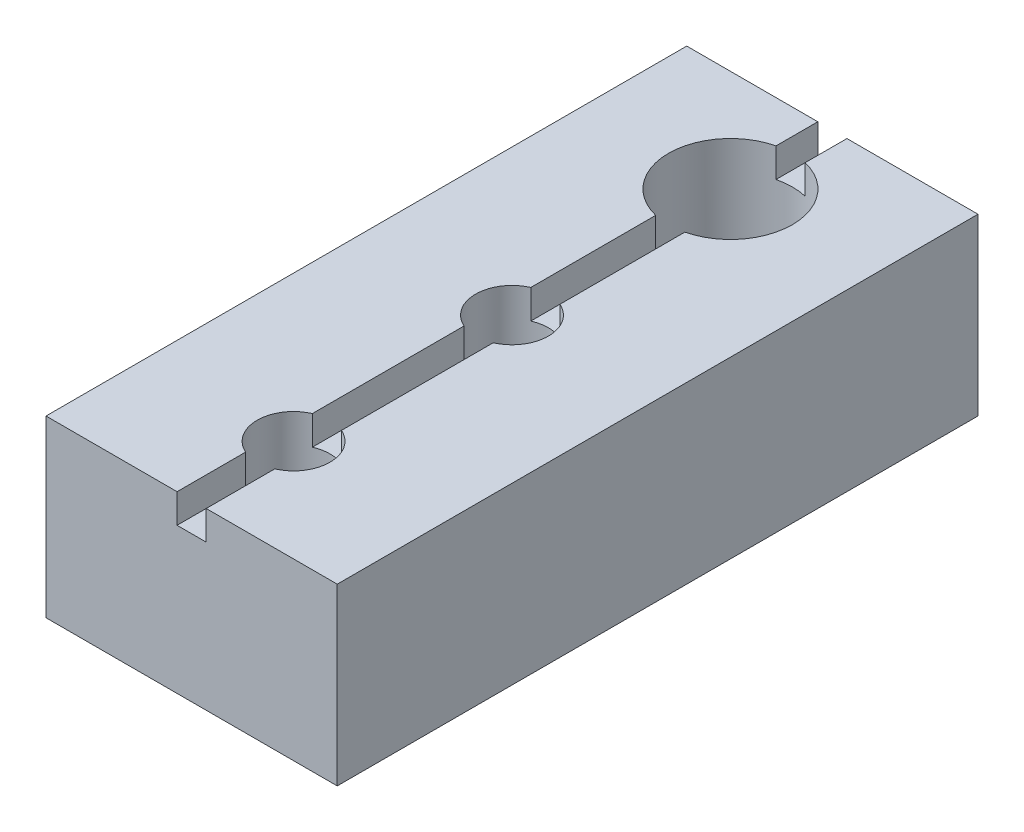
ISO-10303-21;
HEADER;
FILE_DESCRIPTION(('STEP AP214'),'2;1');
FILE_NAME('part.step','',(''),(''),'','','');
FILE_SCHEMA(('AUTOMOTIVE_DESIGN { 1 0 10303 214 1 1 1 1 }'));
ENDSEC;
DATA;
#1=APPLICATION_CONTEXT('core data for automotive mechanical design processes');
#2=APPLICATION_PROTOCOL_DEFINITION('international standard','automotive_design',2000,#1);
#3=PRODUCT_CONTEXT('',#1,'mechanical');
#4=PRODUCT('Part','Part','',(#3));
#5=PRODUCT_RELATED_PRODUCT_CATEGORY('part','',(#4));
#6=PRODUCT_DEFINITION_FORMATION('','',#4);
#7=PRODUCT_DEFINITION_CONTEXT('part definition',#1,'design');
#8=PRODUCT_DEFINITION('design','',#6,#7);
#9=PRODUCT_DEFINITION_SHAPE('','',#8);
#10=(LENGTH_UNIT() NAMED_UNIT(*) SI_UNIT(.MILLI.,.METRE.));
#11=(NAMED_UNIT(*) PLANE_ANGLE_UNIT() SI_UNIT($,.RADIAN.));
#12=(NAMED_UNIT(*) SI_UNIT($,.STERADIAN.) SOLID_ANGLE_UNIT());
#13=UNCERTAINTY_MEASURE_WITH_UNIT(LENGTH_MEASURE(1.E-05),#10,'distance_accuracy_value','');
#14=(GEOMETRIC_REPRESENTATION_CONTEXT(3) GLOBAL_UNCERTAINTY_ASSIGNED_CONTEXT((#13)) GLOBAL_UNIT_ASSIGNED_CONTEXT((#10,
#11,#12)) REPRESENTATION_CONTEXT('',''));
#15=CARTESIAN_POINT('',(0.,0.,0.));
#16=DIRECTION('',(0.,0.,1.));
#17=DIRECTION('',(1.,0.,0.));
#18=AXIS2_PLACEMENT_3D('',#15,#16,#17);
#19=CARTESIAN_POINT('',(10.,6.,22.));
#20=DIRECTION('',(0.,-1.,0.));
#21=DIRECTION('',(0.,0.,-1.));
#22=AXIS2_PLACEMENT_3D('',#19,#20,#21);
#23=PLANE('',#22);
#24=CARTESIAN_POINT('',(0.,6.,-15.));
#25=DIRECTION('',(0.,1.,0.));
#26=DIRECTION('',(0.,0.,1.));
#27=AXIS2_PLACEMENT_3D('',#24,#25,#26);
#28=CIRCLE('',#27,4.24999999999999);
#29=CARTESIAN_POINT('',(0.999999999999999,6.,-10.8693220895354));
#30=VERTEX_POINT('',#29);
#31=CARTESIAN_POINT('',(0.999999999999999,6.,-19.1306779104646));
#32=VERTEX_POINT('',#31);
#33=EDGE_CURVE('E175',#30,#32,#28,.T.);
#34=ORIENTED_EDGE('',*,*,#33,.F.);
#35=DIRECTION('',(0.,0.,-1.));
#36=VECTOR('',#35,1.);
#37=CARTESIAN_POINT('',(0.999999999999999,6.,22.));
#38=LINE('',#37,#36);
#39=CARTESIAN_POINT('',(0.999999999999999,6.,-2.29128784747791));
#40=VERTEX_POINT('',#39);
#41=EDGE_CURVE('E185',#40,#30,#38,.T.);
#42=ORIENTED_EDGE('',*,*,#41,.F.);
#43=CARTESIAN_POINT('',(0.,6.,0.));
#44=DIRECTION('',(0.,1.,0.));
#45=DIRECTION('',(0.,0.,1.));
#46=AXIS2_PLACEMENT_3D('',#43,#44,#45);
#47=CIRCLE('',#46,2.49999999999999);
#48=CARTESIAN_POINT('',(0.999999999999999,6.,2.29128784747791));
#49=VERTEX_POINT('',#48);
#50=EDGE_CURVE('E229',#49,#40,#47,.T.);
#51=ORIENTED_EDGE('',*,*,#50,.F.);
#52=CARTESIAN_POINT('',(0.999999999999999,6.,12.7087121525221));
#53=VERTEX_POINT('',#52);
#54=EDGE_CURVE('E193',#53,#49,#38,.T.);
#55=ORIENTED_EDGE('',*,*,#54,.F.);
#56=CARTESIAN_POINT('',(0.,6.,15.));
#57=DIRECTION('',(0.,1.,0.));
#58=DIRECTION('',(0.,0.,1.));
#59=AXIS2_PLACEMENT_3D('',#56,#57,#58);
#60=CIRCLE('',#59,2.49999999999999);
#61=CARTESIAN_POINT('',(0.999999999999997,6.,17.2912878474779));
#62=VERTEX_POINT('',#61);
#63=EDGE_CURVE('E222',#62,#53,#60,.T.);
#64=ORIENTED_EDGE('',*,*,#63,.F.);
#65=CARTESIAN_POINT('',(0.999999999999999,6.,22.));
#66=VERTEX_POINT('',#65);
#67=EDGE_CURVE('E195',#66,#62,#38,.T.);
#68=ORIENTED_EDGE('',*,*,#67,.F.);
#69=DIRECTION('',(-1.,0.,0.));
#70=VECTOR('',#69,1.);
#71=CARTESIAN_POINT('',(10.,6.,22.));
#72=LINE('',#71,#70);
#73=CARTESIAN_POINT('',(10.,6.,22.));
#74=VERTEX_POINT('',#73);
#75=EDGE_CURVE('E244',#74,#66,#72,.T.);
#76=ORIENTED_EDGE('',*,*,#75,.F.);
#77=DIRECTION('',(0.,0.,-1.));
#78=VECTOR('',#77,1.);
#79=CARTESIAN_POINT('',(10.,6.,22.));
#80=LINE('',#79,#78);
#81=CARTESIAN_POINT('',(10.,6.,-22.));
#82=VERTEX_POINT('',#81);
#83=EDGE_CURVE('E258',#74,#82,#80,.T.);
#84=ORIENTED_EDGE('',*,*,#83,.T.);
#85=DIRECTION('',(-1.,0.,0.));
#86=VECTOR('',#85,1.);
#87=CARTESIAN_POINT('',(10.,6.,-22.));
#88=LINE('',#87,#86);
#89=CARTESIAN_POINT('',(0.999999999999999,6.,-22.));
#90=VERTEX_POINT('',#89);
#91=EDGE_CURVE('E239',#82,#90,#88,.T.);
#92=ORIENTED_EDGE('',*,*,#91,.T.);
#93=EDGE_CURVE('E188',#32,#90,#38,.T.);
#94=ORIENTED_EDGE('',*,*,#93,.F.);
#95=EDGE_LOOP('',(#34,#42,#51,#55,#64,#68,#76,#84,#92,#94));
#96=FACE_BOUND('',#95,.T.);
#97=ADVANCED_FACE('F37',(#96),#23,.F.);
#98=CARTESIAN_POINT('',(-1.,6.,-19.1306779104646));
#99=VERTEX_POINT('',#98);
#100=CARTESIAN_POINT('',(-1.,6.,-10.8693220895354));
#101=VERTEX_POINT('',#100);
#102=EDGE_CURVE('E45',#99,#101,#28,.T.);
#103=ORIENTED_EDGE('',*,*,#102,.F.);
#104=DIRECTION('',(0.,0.,-1.));
#105=VECTOR('',#104,1.);
#106=CARTESIAN_POINT('',(-1.,6.,22.));
#107=LINE('',#106,#105);
#108=CARTESIAN_POINT('',(-1.,6.,-22.));
#109=VERTEX_POINT('',#108);
#110=EDGE_CURVE('E205',#99,#109,#107,.T.);
#111=ORIENTED_EDGE('',*,*,#110,.T.);
#112=CARTESIAN_POINT('',(-10.,6.,-22.));
#113=VERTEX_POINT('',#112);
#114=EDGE_CURVE('E254',#109,#113,#88,.T.);
#115=ORIENTED_EDGE('',*,*,#114,.T.);
#116=DIRECTION('',(0.,0.,-1.));
#117=VECTOR('',#116,1.);
#118=CARTESIAN_POINT('',(-10.,6.,22.));
#119=LINE('',#118,#117);
#120=CARTESIAN_POINT('',(-10.,6.,22.));
#121=VERTEX_POINT('',#120);
#122=EDGE_CURVE('E247',#121,#113,#119,.T.);
#123=ORIENTED_EDGE('',*,*,#122,.F.);
#124=CARTESIAN_POINT('',(-1.,6.,22.));
#125=VERTEX_POINT('',#124);
#126=EDGE_CURVE('E243',#125,#121,#72,.T.);
#127=ORIENTED_EDGE('',*,*,#126,.F.);
#128=CARTESIAN_POINT('',(-1.,6.,17.2912878474779));
#129=VERTEX_POINT('',#128);
#130=EDGE_CURVE('E196',#125,#129,#107,.T.);
#131=ORIENTED_EDGE('',*,*,#130,.T.);
#132=CARTESIAN_POINT('',(-1.,6.,12.7087121525221));
#133=VERTEX_POINT('',#132);
#134=EDGE_CURVE('E221',#133,#129,#60,.T.);
#135=ORIENTED_EDGE('',*,*,#134,.F.);
#136=CARTESIAN_POINT('',(-1.,6.,2.29128784747791));
#137=VERTEX_POINT('',#136);
#138=EDGE_CURVE('E204',#133,#137,#107,.T.);
#139=ORIENTED_EDGE('',*,*,#138,.T.);
#140=CARTESIAN_POINT('',(-1.,6.,-2.29128784747791));
#141=VERTEX_POINT('',#140);
#142=EDGE_CURVE('E228',#141,#137,#47,.T.);
#143=ORIENTED_EDGE('',*,*,#142,.F.);
#144=EDGE_CURVE('E384',#141,#101,#107,.T.);
#145=ORIENTED_EDGE('',*,*,#144,.T.);
#146=EDGE_LOOP('',(#103,#111,#115,#123,#127,#131,#135,#139,#143,#145));
#147=FACE_BOUND('',#146,.T.);
#148=ADVANCED_FACE('F345',(#147),#23,.F.);
#149=CARTESIAN_POINT('',(-10.,6.,22.));
#150=DIRECTION('',(1.,0.,0.));
#151=DIRECTION('',(0.,0.,-1.));
#152=AXIS2_PLACEMENT_3D('',#149,#150,#151);
#153=PLANE('',#152);
#154=DIRECTION('',(0.,-1.,0.));
#155=VECTOR('',#154,1.);
#156=CARTESIAN_POINT('',(-10.,6.,-22.));
#157=LINE('',#156,#155);
#158=CARTESIAN_POINT('',(-10.,-6.,-22.));
#159=VERTEX_POINT('',#158);
#160=EDGE_CURVE('E234',#113,#159,#157,.T.);
#161=ORIENTED_EDGE('',*,*,#160,.T.);
#162=DIRECTION('',(0.,0.,-1.));
#163=VECTOR('',#162,1.);
#164=CARTESIAN_POINT('',(-10.,-6.,22.));
#165=LINE('',#164,#163);
#166=CARTESIAN_POINT('',(-10.,-6.,22.));
#167=VERTEX_POINT('',#166);
#168=EDGE_CURVE('E264',#167,#159,#165,.T.);
#169=ORIENTED_EDGE('',*,*,#168,.F.);
#170=DIRECTION('',(0.,-1.,0.));
#171=VECTOR('',#170,1.);
#172=CARTESIAN_POINT('',(-10.,6.,22.));
#173=LINE('',#172,#171);
#174=EDGE_CURVE('E235',#121,#167,#173,.T.);
#175=ORIENTED_EDGE('',*,*,#174,.F.);
#176=ORIENTED_EDGE('',*,*,#122,.T.);
#177=EDGE_LOOP('',(#161,#169,#175,#176));
#178=FACE_BOUND('',#177,.T.);
#179=ADVANCED_FACE('F39',(#178),#153,.F.);
#180=CARTESIAN_POINT('',(10.,-6.,22.));
#181=DIRECTION('',(0.,1.,0.));
#182=DIRECTION('',(0.,0.,1.));
#183=AXIS2_PLACEMENT_3D('',#180,#181,#182);
#184=PLANE('',#183);
#185=CARTESIAN_POINT('',(0.,-6.,-15.));
#186=DIRECTION('',(0.,1.,0.));
#187=DIRECTION('',(0.,0.,1.));
#188=AXIS2_PLACEMENT_3D('',#185,#186,#187);
#189=CIRCLE('',#188,4.25);
#190=CARTESIAN_POINT('',(0.,-6.,-10.75));
#191=VERTEX_POINT('',#190);
#192=EDGE_CURVE('E179',#191,#191,#189,.T.);
#193=ORIENTED_EDGE('',*,*,#192,.T.);
#194=EDGE_LOOP('',(#193));
#195=FACE_BOUND('',#194,.T.);
#196=CARTESIAN_POINT('',(0.,-6.,15.));
#197=DIRECTION('',(0.,1.,0.));
#198=DIRECTION('',(0.,0.,1.));
#199=AXIS2_PLACEMENT_3D('',#196,#197,#198);
#200=CIRCLE('',#199,2.5);
#201=CARTESIAN_POINT('',(0.,-6.,17.5));
#202=VERTEX_POINT('',#201);
#203=EDGE_CURVE('E225',#202,#202,#200,.T.);
#204=ORIENTED_EDGE('',*,*,#203,.T.);
#205=EDGE_LOOP('',(#204));
#206=FACE_BOUND('',#205,.T.);
#207=CARTESIAN_POINT('',(0.,-6.,0.));
#208=DIRECTION('',(0.,1.,0.));
#209=DIRECTION('',(0.,0.,1.));
#210=AXIS2_PLACEMENT_3D('',#207,#208,#209);
#211=CIRCLE('',#210,2.5);
#212=CARTESIAN_POINT('',(0.,-6.,2.5));
#213=VERTEX_POINT('',#212);
#214=EDGE_CURVE('E231',#213,#213,#211,.T.);
#215=ORIENTED_EDGE('',*,*,#214,.T.);
#216=EDGE_LOOP('',(#215));
#217=FACE_BOUND('',#216,.T.);
#218=DIRECTION('',(1.,0.,0.));
#219=VECTOR('',#218,1.);
#220=CARTESIAN_POINT('',(10.,-6.,-22.));
#221=LINE('',#220,#219);
#222=CARTESIAN_POINT('',(10.,-6.,-22.));
#223=VERTEX_POINT('',#222);
#224=EDGE_CURVE('E250',#159,#223,#221,.T.);
#225=ORIENTED_EDGE('',*,*,#224,.T.);
#226=DIRECTION('',(0.,0.,-1.));
#227=VECTOR('',#226,1.);
#228=CARTESIAN_POINT('',(10.,-6.,22.));
#229=LINE('',#228,#227);
#230=CARTESIAN_POINT('',(10.,-6.,22.));
#231=VERTEX_POINT('',#230);
#232=EDGE_CURVE('E261',#231,#223,#229,.T.);
#233=ORIENTED_EDGE('',*,*,#232,.F.);
#234=DIRECTION('',(1.,0.,0.));
#235=VECTOR('',#234,1.);
#236=CARTESIAN_POINT('',(10.,-6.,22.));
#237=LINE('',#236,#235);
#238=EDGE_CURVE('E238',#167,#231,#237,.T.);
#239=ORIENTED_EDGE('',*,*,#238,.F.);
#240=ORIENTED_EDGE('',*,*,#168,.T.);
#241=EDGE_LOOP('',(#225,#233,#239,#240));
#242=FACE_BOUND('',#241,.T.);
#243=ADVANCED_FACE('F330',(#195,#206,#217,#242),#184,.F.);
#244=CARTESIAN_POINT('',(10.,6.,22.));
#245=DIRECTION('',(-1.,0.,0.));
#246=DIRECTION('',(0.,0.,1.));
#247=AXIS2_PLACEMENT_3D('',#244,#245,#246);
#248=PLANE('',#247);
#249=DIRECTION('',(0.,1.,0.));
#250=VECTOR('',#249,1.);
#251=CARTESIAN_POINT('',(10.,6.,-22.));
#252=LINE('',#251,#250);
#253=EDGE_CURVE('E252',#223,#82,#252,.T.);
#254=ORIENTED_EDGE('',*,*,#253,.T.);
#255=ORIENTED_EDGE('',*,*,#83,.F.);
#256=DIRECTION('',(0.,1.,0.));
#257=VECTOR('',#256,1.);
#258=CARTESIAN_POINT('',(10.,6.,22.));
#259=LINE('',#258,#257);
#260=EDGE_CURVE('E241',#231,#74,#259,.T.);
#261=ORIENTED_EDGE('',*,*,#260,.F.);
#262=ORIENTED_EDGE('',*,*,#232,.T.);
#263=EDGE_LOOP('',(#254,#255,#261,#262));
#264=FACE_BOUND('',#263,.T.);
#265=ADVANCED_FACE('F355',(#264),#248,.F.);
#266=CARTESIAN_POINT('',(0.,0.,22.));
#267=DIRECTION('',(0.,0.,-1.));
#268=DIRECTION('',(-1.,0.,0.));
#269=AXIS2_PLACEMENT_3D('',#266,#267,#268);
#270=PLANE('',#269);
#271=DIRECTION('',(-1.,0.,0.));
#272=VECTOR('',#271,1.);
#273=CARTESIAN_POINT('',(1.,4.,22.));
#274=LINE('',#273,#272);
#275=CARTESIAN_POINT('',(1.,4.,22.));
#276=VERTEX_POINT('',#275);
#277=CARTESIAN_POINT('',(-1.,4.,22.));
#278=VERTEX_POINT('',#277);
#279=EDGE_CURVE('E311',#276,#278,#274,.T.);
#280=ORIENTED_EDGE('',*,*,#279,.T.);
#281=DIRECTION('',(0.,1.,0.));
#282=VECTOR('',#281,1.);
#283=CARTESIAN_POINT('',(-1.,4.,22.));
#284=LINE('',#283,#282);
#285=EDGE_CURVE('E304',#278,#125,#284,.T.);
#286=ORIENTED_EDGE('',*,*,#285,.T.);
#287=ORIENTED_EDGE('',*,*,#126,.T.);
#288=ORIENTED_EDGE('',*,*,#174,.T.);
#289=ORIENTED_EDGE('',*,*,#238,.T.);
#290=ORIENTED_EDGE('',*,*,#260,.T.);
#291=ORIENTED_EDGE('',*,*,#75,.T.);
#292=DIRECTION('',(0.,-1.,0.));
#293=VECTOR('',#292,1.);
#294=CARTESIAN_POINT('',(1.,4.,22.));
#295=LINE('',#294,#293);
#296=EDGE_CURVE('E314',#66,#276,#295,.T.);
#297=ORIENTED_EDGE('',*,*,#296,.T.);
#298=EDGE_LOOP('',(#280,#286,#287,#288,#289,#290,#291,#297));
#299=FACE_BOUND('',#298,.T.);
#300=ADVANCED_FACE('F357',(#299),#270,.F.);
#301=CARTESIAN_POINT('',(0.,0.,-22.));
#302=DIRECTION('',(0.,0.,-1.));
#303=DIRECTION('',(-1.,0.,0.));
#304=AXIS2_PLACEMENT_3D('',#301,#302,#303);
#305=PLANE('',#304);
#306=DIRECTION('',(0.,1.,0.));
#307=VECTOR('',#306,1.);
#308=CARTESIAN_POINT('',(-1.,4.,-22.));
#309=LINE('',#308,#307);
#310=CARTESIAN_POINT('',(-1.,4.,-22.));
#311=VERTEX_POINT('',#310);
#312=EDGE_CURVE('E308',#311,#109,#309,.T.);
#313=ORIENTED_EDGE('',*,*,#312,.F.);
#314=DIRECTION('',(-1.,0.,0.));
#315=VECTOR('',#314,1.);
#316=CARTESIAN_POINT('',(1.,4.,-22.));
#317=LINE('',#316,#315);
#318=CARTESIAN_POINT('',(1.,4.,-22.));
#319=VERTEX_POINT('',#318);
#320=EDGE_CURVE('E301',#319,#311,#317,.T.);
#321=ORIENTED_EDGE('',*,*,#320,.F.);
#322=DIRECTION('',(0.,-1.,0.));
#323=VECTOR('',#322,1.);
#324=CARTESIAN_POINT('',(1.,4.,-22.));
#325=LINE('',#324,#323);
#326=EDGE_CURVE('E305',#90,#319,#325,.T.);
#327=ORIENTED_EDGE('',*,*,#326,.F.);
#328=ORIENTED_EDGE('',*,*,#91,.F.);
#329=ORIENTED_EDGE('',*,*,#253,.F.);
#330=ORIENTED_EDGE('',*,*,#224,.F.);
#331=ORIENTED_EDGE('',*,*,#160,.F.);
#332=ORIENTED_EDGE('',*,*,#114,.F.);
#333=EDGE_LOOP('',(#313,#321,#327,#328,#329,#330,#331,#332));
#334=FACE_BOUND('',#333,.T.);
#335=ADVANCED_FACE('F353',(#334),#305,.T.);
#336=CARTESIAN_POINT('',(0.,6.,0.));
#337=DIRECTION('',(0.,1.,0.));
#338=DIRECTION('',(0.,0.,1.));
#339=AXIS2_PLACEMENT_3D('',#336,#337,#338);
#340=CYLINDRICAL_SURFACE('',#339,2.49999999999999);
#341=ORIENTED_EDGE('',*,*,#214,.F.);
#342=EDGE_LOOP('',(#341));
#343=FACE_BOUND('',#342,.T.);
#344=CARTESIAN_POINT('',(0.,4.,0.));
#345=DIRECTION('',(0.,-1.,0.));
#346=DIRECTION('',(0.,0.,-1.));
#347=AXIS2_PLACEMENT_3D('',#344,#345,#346);
#348=CIRCLE('',#347,2.49999999999999);
#349=CARTESIAN_POINT('',(0.999999999999999,4.,-2.29128784747791));
#350=VERTEX_POINT('',#349);
#351=CARTESIAN_POINT('',(-1.,4.,-2.29128784747791));
#352=VERTEX_POINT('',#351);
#353=EDGE_CURVE('E211',#350,#352,#348,.F.);
#354=ORIENTED_EDGE('',*,*,#353,.T.);
#355=DIRECTION('',(0.,1.,0.));
#356=VECTOR('',#355,1.);
#357=CARTESIAN_POINT('',(-1.,6.,-2.29128784747791));
#358=LINE('',#357,#356);
#359=EDGE_CURVE('E215',#352,#141,#358,.T.);
#360=ORIENTED_EDGE('',*,*,#359,.T.);
#361=ORIENTED_EDGE('',*,*,#142,.T.);
#362=DIRECTION('',(0.,1.,0.));
#363=VECTOR('',#362,1.);
#364=CARTESIAN_POINT('',(-1.,6.,2.29128784747791));
#365=LINE('',#364,#363);
#366=CARTESIAN_POINT('',(-1.,4.,2.29128784747791));
#367=VERTEX_POINT('',#366);
#368=EDGE_CURVE('E218',#137,#367,#365,.F.);
#369=ORIENTED_EDGE('',*,*,#368,.T.);
#370=CARTESIAN_POINT('',(1.,4.,2.29128784747791));
#371=VERTEX_POINT('',#370);
#372=EDGE_CURVE('E214',#367,#371,#348,.F.);
#373=ORIENTED_EDGE('',*,*,#372,.T.);
#374=DIRECTION('',(0.,1.,0.));
#375=VECTOR('',#374,1.);
#376=CARTESIAN_POINT('',(0.999999999999999,6.,2.29128784747791));
#377=LINE('',#376,#375);
#378=EDGE_CURVE('E206',#371,#49,#377,.T.);
#379=ORIENTED_EDGE('',*,*,#378,.T.);
#380=ORIENTED_EDGE('',*,*,#50,.T.);
#381=DIRECTION('',(0.,1.,0.));
#382=VECTOR('',#381,1.);
#383=CARTESIAN_POINT('',(0.999999999999999,6.,-2.29128784747791));
#384=LINE('',#383,#382);
#385=EDGE_CURVE('E192',#40,#350,#384,.F.);
#386=ORIENTED_EDGE('',*,*,#385,.T.);
#387=EDGE_LOOP('',(#354,#360,#361,#369,#373,#379,#380,#386));
#388=FACE_BOUND('',#387,.T.);
#389=ADVANCED_FACE('F403',(#343,#388),#340,.F.);
#390=CARTESIAN_POINT('',(0.,6.,15.));
#391=DIRECTION('',(0.,1.,0.));
#392=DIRECTION('',(0.,0.,1.));
#393=AXIS2_PLACEMENT_3D('',#390,#391,#392);
#394=CYLINDRICAL_SURFACE('',#393,2.49999999999999);
#395=ORIENTED_EDGE('',*,*,#203,.F.);
#396=EDGE_LOOP('',(#395));
#397=FACE_BOUND('',#396,.T.);
#398=CARTESIAN_POINT('',(0.,4.,15.));
#399=DIRECTION('',(0.,-1.,0.));
#400=DIRECTION('',(0.,0.,-1.));
#401=AXIS2_PLACEMENT_3D('',#398,#399,#400);
#402=CIRCLE('',#401,2.49999999999999);
#403=CARTESIAN_POINT('',(0.999999999999999,4.,12.7087121525221));
#404=VERTEX_POINT('',#403);
#405=CARTESIAN_POINT('',(-1.,4.,12.7087121525221));
#406=VERTEX_POINT('',#405);
#407=EDGE_CURVE('E274',#404,#406,#402,.F.);
#408=ORIENTED_EDGE('',*,*,#407,.T.);
#409=DIRECTION('',(0.,1.,0.));
#410=VECTOR('',#409,1.);
#411=CARTESIAN_POINT('',(-1.,6.,12.7087121525221));
#412=LINE('',#411,#410);
#413=EDGE_CURVE('E279',#406,#133,#412,.T.);
#414=ORIENTED_EDGE('',*,*,#413,.T.);
#415=ORIENTED_EDGE('',*,*,#134,.T.);
#416=DIRECTION('',(0.,1.,0.));
#417=VECTOR('',#416,1.);
#418=CARTESIAN_POINT('',(-1.,6.,17.2912878474779));
#419=LINE('',#418,#417);
#420=CARTESIAN_POINT('',(-1.,4.,17.2912878474779));
#421=VERTEX_POINT('',#420);
#422=EDGE_CURVE('E273',#129,#421,#419,.F.);
#423=ORIENTED_EDGE('',*,*,#422,.T.);
#424=CARTESIAN_POINT('',(1.,4.,17.2912878474779));
#425=VERTEX_POINT('',#424);
#426=EDGE_CURVE('E270',#421,#425,#402,.F.);
#427=ORIENTED_EDGE('',*,*,#426,.T.);
#428=DIRECTION('',(0.,1.,0.));
#429=VECTOR('',#428,1.);
#430=CARTESIAN_POINT('',(0.999999999999999,6.,17.2912878474779));
#431=LINE('',#430,#429);
#432=EDGE_CURVE('E267',#425,#62,#431,.T.);
#433=ORIENTED_EDGE('',*,*,#432,.T.);
#434=ORIENTED_EDGE('',*,*,#63,.T.);
#435=DIRECTION('',(0.,1.,0.));
#436=VECTOR('',#435,1.);
#437=CARTESIAN_POINT('',(0.999999999999999,6.,12.7087121525221));
#438=LINE('',#437,#436);
#439=EDGE_CURVE('E277',#53,#404,#438,.F.);
#440=ORIENTED_EDGE('',*,*,#439,.T.);
#441=EDGE_LOOP('',(#408,#414,#415,#423,#427,#433,#434,#440));
#442=FACE_BOUND('',#441,.T.);
#443=ADVANCED_FACE('F286',(#397,#442),#394,.F.);
#444=CARTESIAN_POINT('',(1.,4.,22.));
#445=DIRECTION('',(1.,0.,0.));
#446=DIRECTION('',(0.,1.,0.));
#447=AXIS2_PLACEMENT_3D('',#444,#445,#446);
#448=PLANE('',#447);
#449=DIRECTION('',(0.,0.,-1.));
#450=VECTOR('',#449,1.);
#451=CARTESIAN_POINT('',(1.,4.,22.));
#452=LINE('',#451,#450);
#453=EDGE_CURVE('E200',#276,#425,#452,.T.);
#454=ORIENTED_EDGE('',*,*,#453,.F.);
#455=ORIENTED_EDGE('',*,*,#296,.F.);
#456=ORIENTED_EDGE('',*,*,#67,.T.);
#457=ORIENTED_EDGE('',*,*,#432,.F.);
#458=EDGE_LOOP('',(#454,#455,#456,#457));
#459=FACE_BOUND('',#458,.T.);
#460=ADVANCED_FACE('F342',(#459),#448,.F.);
#461=CARTESIAN_POINT('',(1.,4.,22.));
#462=DIRECTION('',(0.,-1.,0.));
#463=DIRECTION('',(0.,0.,-1.));
#464=AXIS2_PLACEMENT_3D('',#461,#462,#463);
#465=PLANE('',#464);
#466=DIRECTION('',(0.,0.,-1.));
#467=VECTOR('',#466,1.);
#468=CARTESIAN_POINT('',(-1.,4.,22.));
#469=LINE('',#468,#467);
#470=EDGE_CURVE('E209',#278,#421,#469,.T.);
#471=ORIENTED_EDGE('',*,*,#470,.F.);
#472=ORIENTED_EDGE('',*,*,#279,.F.);
#473=ORIENTED_EDGE('',*,*,#453,.T.);
#474=ORIENTED_EDGE('',*,*,#426,.F.);
#475=EDGE_LOOP('',(#471,#472,#473,#474));
#476=FACE_BOUND('',#475,.T.);
#477=ADVANCED_FACE('F394',(#476),#465,.F.);
#478=CARTESIAN_POINT('',(-1.,4.,22.));
#479=DIRECTION('',(-1.,0.,0.));
#480=DIRECTION('',(0.,-1.,0.));
#481=AXIS2_PLACEMENT_3D('',#478,#479,#480);
#482=PLANE('',#481);
#483=ORIENTED_EDGE('',*,*,#130,.F.);
#484=ORIENTED_EDGE('',*,*,#285,.F.);
#485=ORIENTED_EDGE('',*,*,#470,.T.);
#486=ORIENTED_EDGE('',*,*,#422,.F.);
#487=EDGE_LOOP('',(#483,#484,#485,#486));
#488=FACE_BOUND('',#487,.T.);
#489=ADVANCED_FACE('F398',(#488),#482,.F.);
#490=EDGE_CURVE('E291',#404,#371,#452,.T.);
#491=ORIENTED_EDGE('',*,*,#490,.F.);
#492=ORIENTED_EDGE('',*,*,#439,.F.);
#493=ORIENTED_EDGE('',*,*,#54,.T.);
#494=ORIENTED_EDGE('',*,*,#378,.F.);
#495=EDGE_LOOP('',(#491,#492,#493,#494));
#496=FACE_BOUND('',#495,.T.);
#497=ADVANCED_FACE('F412',(#496),#448,.F.);
#498=EDGE_CURVE('E294',#406,#367,#469,.T.);
#499=ORIENTED_EDGE('',*,*,#498,.F.);
#500=ORIENTED_EDGE('',*,*,#407,.F.);
#501=ORIENTED_EDGE('',*,*,#490,.T.);
#502=ORIENTED_EDGE('',*,*,#372,.F.);
#503=EDGE_LOOP('',(#499,#500,#501,#502));
#504=FACE_BOUND('',#503,.T.);
#505=ADVANCED_FACE('F290',(#504),#465,.F.);
#506=ORIENTED_EDGE('',*,*,#138,.F.);
#507=ORIENTED_EDGE('',*,*,#413,.F.);
#508=ORIENTED_EDGE('',*,*,#498,.T.);
#509=ORIENTED_EDGE('',*,*,#368,.F.);
#510=EDGE_LOOP('',(#506,#507,#508,#509));
#511=FACE_BOUND('',#510,.T.);
#512=ADVANCED_FACE('F418',(#511),#482,.F.);
#513=ORIENTED_EDGE('',*,*,#41,.T.);
#514=DIRECTION('',(0.,1.,0.));
#515=VECTOR('',#514,1.);
#516=CARTESIAN_POINT('',(0.999999999999999,6.,-10.8693220895354));
#517=LINE('',#516,#515);
#518=CARTESIAN_POINT('',(1.,4.,-10.8693220895354));
#519=VERTEX_POINT('',#518);
#520=EDGE_CURVE('E172',#30,#519,#517,.F.);
#521=ORIENTED_EDGE('',*,*,#520,.T.);
#522=EDGE_CURVE('E60',#350,#519,#452,.T.);
#523=ORIENTED_EDGE('',*,*,#522,.F.);
#524=ORIENTED_EDGE('',*,*,#385,.F.);
#525=EDGE_LOOP('',(#513,#521,#523,#524));
#526=FACE_BOUND('',#525,.T.);
#527=ADVANCED_FACE('F190',(#526),#448,.F.);
#528=ORIENTED_EDGE('',*,*,#522,.T.);
#529=CARTESIAN_POINT('',(0.,4.,-15.));
#530=DIRECTION('',(0.,-1.,0.));
#531=DIRECTION('',(0.,0.,-1.));
#532=AXIS2_PLACEMENT_3D('',#529,#530,#531);
#533=CIRCLE('',#532,4.24999999999999);
#534=CARTESIAN_POINT('',(-1.,4.,-10.8693220895354));
#535=VERTEX_POINT('',#534);
#536=EDGE_CURVE('E11',#519,#535,#533,.T.);
#537=ORIENTED_EDGE('',*,*,#536,.T.);
#538=EDGE_CURVE('E296',#352,#535,#469,.T.);
#539=ORIENTED_EDGE('',*,*,#538,.F.);
#540=ORIENTED_EDGE('',*,*,#353,.F.);
#541=EDGE_LOOP('',(#528,#537,#539,#540));
#542=FACE_BOUND('',#541,.T.);
#543=ADVANCED_FACE('F408',(#542),#465,.F.);
#544=ORIENTED_EDGE('',*,*,#538,.T.);
#545=DIRECTION('',(0.,1.,0.));
#546=VECTOR('',#545,1.);
#547=CARTESIAN_POINT('',(-1.,6.,-10.8693220895354));
#548=LINE('',#547,#546);
#549=EDGE_CURVE('E178',#535,#101,#548,.T.);
#550=ORIENTED_EDGE('',*,*,#549,.T.);
#551=ORIENTED_EDGE('',*,*,#144,.F.);
#552=ORIENTED_EDGE('',*,*,#359,.F.);
#553=EDGE_LOOP('',(#544,#550,#551,#552));
#554=FACE_BOUND('',#553,.T.);
#555=ADVANCED_FACE('F406',(#554),#482,.F.);
#556=ORIENTED_EDGE('',*,*,#110,.F.);
#557=DIRECTION('',(0.,1.,0.));
#558=VECTOR('',#557,1.);
#559=CARTESIAN_POINT('',(-1.,6.,-19.1306779104646));
#560=LINE('',#559,#558);
#561=CARTESIAN_POINT('',(-1.,4.,-19.1306779104646));
#562=VERTEX_POINT('',#561);
#563=EDGE_CURVE('E52',#99,#562,#560,.F.);
#564=ORIENTED_EDGE('',*,*,#563,.T.);
#565=EDGE_CURVE('E298',#562,#311,#469,.T.);
#566=ORIENTED_EDGE('',*,*,#565,.T.);
#567=ORIENTED_EDGE('',*,*,#312,.T.);
#568=EDGE_LOOP('',(#556,#564,#566,#567));
#569=FACE_BOUND('',#568,.T.);
#570=ADVANCED_FACE('F385',(#569),#482,.F.);
#571=ORIENTED_EDGE('',*,*,#565,.F.);
#572=CARTESIAN_POINT('',(0.,4.,-15.));
#573=DIRECTION('',(0.,-1.,0.));
#574=DIRECTION('',(0.,0.,-1.));
#575=AXIS2_PLACEMENT_3D('',#572,#573,#574);
#576=CIRCLE('',#575,4.24999999999999);
#577=CARTESIAN_POINT('',(0.999999999999999,4.,-19.1306779104646));
#578=VERTEX_POINT('',#577);
#579=EDGE_CURVE('E320',#562,#578,#576,.T.);
#580=ORIENTED_EDGE('',*,*,#579,.T.);
#581=EDGE_CURVE('E199',#578,#319,#452,.T.);
#582=ORIENTED_EDGE('',*,*,#581,.T.);
#583=ORIENTED_EDGE('',*,*,#320,.T.);
#584=EDGE_LOOP('',(#571,#580,#582,#583));
#585=FACE_BOUND('',#584,.T.);
#586=ADVANCED_FACE('F339',(#585),#465,.F.);
#587=ORIENTED_EDGE('',*,*,#581,.F.);
#588=DIRECTION('',(0.,1.,0.));
#589=VECTOR('',#588,1.);
#590=CARTESIAN_POINT('',(0.999999999999999,6.,-19.1306779104646));
#591=LINE('',#590,#589);
#592=EDGE_CURVE('E323',#578,#32,#591,.T.);
#593=ORIENTED_EDGE('',*,*,#592,.T.);
#594=ORIENTED_EDGE('',*,*,#93,.T.);
#595=ORIENTED_EDGE('',*,*,#326,.T.);
#596=EDGE_LOOP('',(#587,#593,#594,#595));
#597=FACE_BOUND('',#596,.T.);
#598=ADVANCED_FACE('F334',(#597),#448,.F.);
#599=CARTESIAN_POINT('',(0.,6.,-15.));
#600=DIRECTION('',(0.,1.,0.));
#601=DIRECTION('',(0.,0.,1.));
#602=AXIS2_PLACEMENT_3D('',#599,#600,#601);
#603=CYLINDRICAL_SURFACE('',#602,4.24999999999999);
#604=ORIENTED_EDGE('',*,*,#192,.F.);
#605=EDGE_LOOP('',(#604));
#606=FACE_BOUND('',#605,.T.);
#607=ORIENTED_EDGE('',*,*,#102,.T.);
#608=ORIENTED_EDGE('',*,*,#549,.F.);
#609=ORIENTED_EDGE('',*,*,#536,.F.);
#610=ORIENTED_EDGE('',*,*,#520,.F.);
#611=ORIENTED_EDGE('',*,*,#33,.T.);
#612=ORIENTED_EDGE('',*,*,#592,.F.);
#613=ORIENTED_EDGE('',*,*,#579,.F.);
#614=ORIENTED_EDGE('',*,*,#563,.F.);
#615=EDGE_LOOP('',(#607,#608,#609,#610,#611,#612,#613,#614));
#616=FACE_BOUND('',#615,.T.);
#617=ADVANCED_FACE('F174',(#606,#616),#603,.F.);
#618=CLOSED_SHELL('',(#97,#148,#179,#243,#265,#300,#335,#389,#443,#460,#477,#489,#497,#505,#512,
#527,#543,#555,#570,#586,#598,#617));
#619=MANIFOLD_SOLID_BREP('B2',#618);
#620=ADVANCED_BREP_SHAPE_REPRESENTATION('',(#18,#619),#14);
#621=SHAPE_DEFINITION_REPRESENTATION(#9,#620);
ENDSEC;
END-ISO-10303-21;
